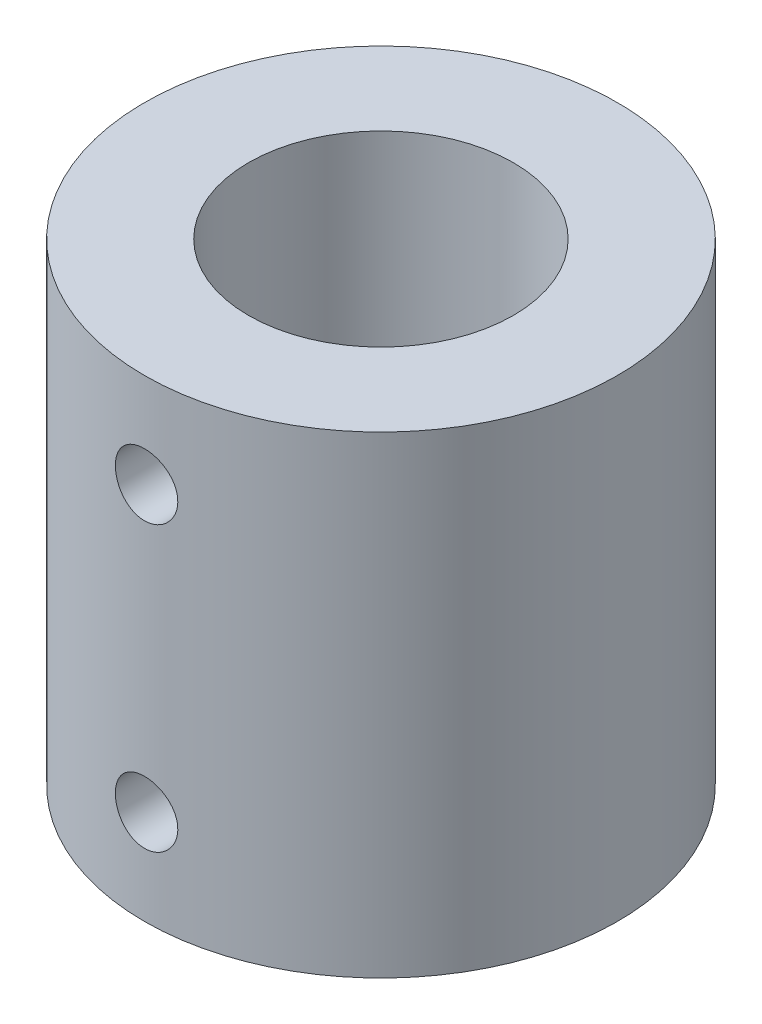
ISO-10303-21;
HEADER;
FILE_DESCRIPTION(('STEP AP214'),'2;1');
FILE_NAME('part.step','',(''),(''),'','','');
FILE_SCHEMA(('AUTOMOTIVE_DESIGN { 1 0 10303 214 1 1 1 1 }'));
ENDSEC;
DATA;
#1=APPLICATION_CONTEXT('core data for automotive mechanical design processes');
#2=APPLICATION_PROTOCOL_DEFINITION('international standard','automotive_design',2000,#1);
#3=PRODUCT_CONTEXT('',#1,'mechanical');
#4=PRODUCT('Part','Part','',(#3));
#5=PRODUCT_RELATED_PRODUCT_CATEGORY('part','',(#4));
#6=PRODUCT_DEFINITION_FORMATION('','',#4);
#7=PRODUCT_DEFINITION_CONTEXT('part definition',#1,'design');
#8=PRODUCT_DEFINITION('design','',#6,#7);
#9=PRODUCT_DEFINITION_SHAPE('','',#8);
#10=(LENGTH_UNIT() NAMED_UNIT(*) SI_UNIT(.MILLI.,.METRE.));
#11=(NAMED_UNIT(*) PLANE_ANGLE_UNIT() SI_UNIT($,.RADIAN.));
#12=(NAMED_UNIT(*) SI_UNIT($,.STERADIAN.) SOLID_ANGLE_UNIT());
#13=UNCERTAINTY_MEASURE_WITH_UNIT(LENGTH_MEASURE(1.E-05),#10,'distance_accuracy_value','');
#14=(GEOMETRIC_REPRESENTATION_CONTEXT(3) GLOBAL_UNCERTAINTY_ASSIGNED_CONTEXT((#13)) GLOBAL_UNIT_ASSIGNED_CONTEXT((#10,
#11,#12)) REPRESENTATION_CONTEXT('',''));
#15=CARTESIAN_POINT('',(0.,0.,0.));
#16=DIRECTION('',(0.,0.,1.));
#17=DIRECTION('',(1.,0.,0.));
#18=AXIS2_PLACEMENT_3D('',#15,#16,#17);
#19=CARTESIAN_POINT('',(0.,25.,0.));
#20=DIRECTION('',(0.,-1.,0.));
#21=DIRECTION('',(0.,0.,-1.));
#22=AXIS2_PLACEMENT_3D('',#19,#20,#21);
#23=CYLINDRICAL_SURFACE('',#22,3.);
#24=CARTESIAN_POINT('',(0.,12.5,0.));
#25=DIRECTION('',(0.,1.,0.));
#26=DIRECTION('',(0.,0.,1.));
#27=AXIS2_PLACEMENT_3D('',#24,#25,#26);
#28=CIRCLE('',#27,3.);
#29=CARTESIAN_POINT('',(0.,12.5,3.));
#30=VERTEX_POINT('',#29);
#31=EDGE_CURVE('E66',#30,#30,#28,.T.);
#32=ORIENTED_EDGE('',*,*,#31,.T.);
#33=EDGE_LOOP('',(#32));
#34=FACE_BOUND('',#33,.T.);
#35=CARTESIAN_POINT('',(0.,0.,0.));
#36=DIRECTION('',(0.,1.,0.));
#37=DIRECTION('',(0.,0.,1.));
#38=AXIS2_PLACEMENT_3D('',#35,#36,#37);
#39=CIRCLE('',#38,3.);
#40=CARTESIAN_POINT('',(0.,0.,3.));
#41=VERTEX_POINT('',#40);
#42=EDGE_CURVE('E61',#41,#41,#39,.T.);
#43=ORIENTED_EDGE('',*,*,#42,.F.);
#44=EDGE_LOOP('',(#43));
#45=FACE_BOUND('',#44,.T.);
#46=CARTESIAN_POINT('',(-1.65,5.,2.50549396327351));
#47=CARTESIAN_POINT('',(-1.64999358115515,4.91543775587579,2.50550290729145));
#48=CARTESIAN_POINT('',(-1.64345412095508,4.83080158035625,2.50984278304633));
#49=CARTESIAN_POINT('',(-1.61768357796128,4.6642419893439,2.52652305472094));
#50=CARTESIAN_POINT('',(-1.59843109830519,4.58232339226291,2.5388769381334));
#51=CARTESIAN_POINT('',(-1.54839133504121,4.42394184165835,2.56969514424061));
#52=CARTESIAN_POINT('',(-1.51767597794515,4.34744833636022,2.58812128253768));
#53=CARTESIAN_POINT('',(-1.44580368027316,4.20072925067674,2.62894573960704));
#54=CARTESIAN_POINT('',(-1.40464456372702,4.13050498062123,2.65134488586739));
#55=CARTESIAN_POINT('',(-1.30818987552103,3.99050697951391,2.70034227169485));
#56=CARTESIAN_POINT('',(-1.25188597568528,3.92149614307965,2.72713610292843));
#57=CARTESIAN_POINT('',(-1.12882249865068,3.79328457524384,2.78033402122329));
#58=CARTESIAN_POINT('',(-1.06205670422282,3.73408972055437,2.8067378662503));
#59=CARTESIAN_POINT('',(-0.912984038802342,3.62218721247504,2.85888255333956));
#60=CARTESIAN_POINT('',(-0.829835009326252,3.57047291087437,2.88437182872328));
#61=CARTESIAN_POINT('',(-0.654349556397893,3.48212209381967,2.92916377464779));
#62=CARTESIAN_POINT('',(-0.562020200659683,3.44547408910424,2.94847115688416));
#63=CARTESIAN_POINT('',(-0.37892285434317,3.39150601520037,2.97729382330391));
#64=CARTESIAN_POINT('',(-0.288663762188307,3.37283185672805,2.98749000620555));
#65=CARTESIAN_POINT('',(-0.105768848971923,3.35082522164806,2.99953120217528));
#66=CARTESIAN_POINT('',(-0.0131348834272864,3.34748111400143,3.00138254652496));
#67=CARTESIAN_POINT('',(0.161456942743379,3.3558401237369,2.99679126383707));
#68=CARTESIAN_POINT('',(0.243517036042417,3.36600430103803,2.99119680588262));
#69=CARTESIAN_POINT('',(0.40454893471368,3.39825613933327,2.97370139090637));
#70=CARTESIAN_POINT('',(0.483520502425808,3.42034471597395,2.96179994958743));
#71=CARTESIAN_POINT('',(0.637279429786408,3.47581759545011,2.93258792133284));
#72=CARTESIAN_POINT('',(0.712012587065493,3.50932095125488,2.91522047737549));
#73=CARTESIAN_POINT('',(0.854941741305339,3.58643144614225,2.87655421939416));
#74=CARTESIAN_POINT('',(0.923135637298121,3.63004181718505,2.85525414826244));
#75=CARTESIAN_POINT('',(1.05891717191853,3.73148475004153,2.80791814382438));
#76=CARTESIAN_POINT('',(1.12564617195586,3.7903439308726,2.78161920172535));
#77=CARTESIAN_POINT('',(1.24879377983835,3.91792420544975,2.72855637999779));
#78=CARTESIAN_POINT('',(1.3052016470546,3.98665544125848,2.70179204741386));
#79=CARTESIAN_POINT('',(1.41104757147093,4.13929795422943,2.64816260741378));
#80=CARTESIAN_POINT('',(1.45943898084593,4.22401217497651,2.62149493557528));
#81=CARTESIAN_POINT('',(1.54096072440202,4.4020876587557,2.57442669454811));
#82=CARTESIAN_POINT('',(1.57410870202277,4.49543877389511,2.55401888906632));
#83=CARTESIAN_POINT('',(1.621324807476,4.68038243391405,2.52428868885372));
#84=CARTESIAN_POINT('',(1.63671808149072,4.77150770718116,2.51420388175754));
#85=CARTESIAN_POINT('',(1.651976005483,4.95556143260455,2.50421132283931));
#86=CARTESIAN_POINT('',(1.65185841284551,5.0484877010052,2.50429193328554));
#87=CARTESIAN_POINT('',(1.63731066997579,5.21898069677553,2.51381291635781));
#88=CARTESIAN_POINT('',(1.6249632757909,5.29681676278818,2.52189118280772));
#89=CARTESIAN_POINT('',(1.58963092545288,5.4490948427084,2.54430898316227));
#90=CARTESIAN_POINT('',(1.56664130047229,5.52353535119722,2.55865126498177));
#91=CARTESIAN_POINT('',(1.50974087534156,5.67056841434069,2.59264701052962));
#92=CARTESIAN_POINT('',(1.47541058671725,5.74295082069504,2.61249886195853));
#93=CARTESIAN_POINT('',(1.39715088074391,5.88136153298298,2.6551752562818));
#94=CARTESIAN_POINT('',(1.35321671440464,5.94738667198259,2.67800126759515));
#95=CARTESIAN_POINT('',(1.24890384728535,6.08217598283305,2.72838745980259));
#96=CARTESIAN_POINT('',(1.18702256034847,6.14971665545365,2.75612471210542));
#97=CARTESIAN_POINT('',(1.05259034248068,6.27394463458245,2.81021466477288));
#98=CARTESIAN_POINT('',(0.980033198593376,6.33062557660595,2.83656654669951));
#99=CARTESIAN_POINT('',(0.821591432017623,6.43418356477834,2.88655886174343));
#100=CARTESIAN_POINT('',(0.735218364495388,6.48041980778174,2.90999476284885));
#101=CARTESIAN_POINT('',(0.554269536180266,6.55721430537587,2.94980224898628));
#102=CARTESIAN_POINT('',(0.459702424085395,6.58778886056153,2.96618117604292));
#103=CARTESIAN_POINT('',(0.275417797995458,6.62930611839183,2.98862325067975));
#104=CARTESIAN_POINT('',(0.186187129425339,6.64193096934435,2.99556705432428));
#105=CARTESIAN_POINT('',(0.00661676308886672,6.65243189343455,3.00133436858647));
#106=CARTESIAN_POINT('',(-0.0837223254250917,6.65031573581962,3.00016215675142));
#107=CARTESIAN_POINT('',(-0.25435836629703,6.63233007153813,2.99031042427524));
#108=CARTESIAN_POINT('',(-0.334831363047832,6.61770633320567,2.98231104671828));
#109=CARTESIAN_POINT('',(-0.491985833876877,6.57703517800952,2.96044701025379));
#110=CARTESIAN_POINT('',(-0.568666854326146,6.55098639804466,2.94658165149358));
#111=CARTESIAN_POINT('',(-0.719080279481092,6.48738736796038,2.91359875185443));
#112=CARTESIAN_POINT('',(-0.792622296205401,6.44947440595497,2.89431787940932));
#113=CARTESIAN_POINT('',(-0.932542405269453,6.36367449851233,2.85231650614788));
#114=CARTESIAN_POINT('',(-0.998917583844718,6.31578351940048,2.82959461529654));
#115=CARTESIAN_POINT('',(-1.13072210629174,6.20507399834962,2.77974517125015));
#116=CARTESIAN_POINT('',(-1.19516495605846,6.14117216627433,2.75241145940814));
#117=CARTESIAN_POINT('',(-1.31290440702821,6.00349286244808,2.69823878537055));
#118=CARTESIAN_POINT('',(-1.36618742691371,5.92970353472665,2.67140046184162));
#119=CARTESIAN_POINT('',(-1.46345962344263,5.76827599994856,2.61945108088931));
#120=CARTESIAN_POINT('',(-1.50659692748028,5.68004360140735,2.59457299089604));
#121=CARTESIAN_POINT('',(-1.57680093269354,5.49582119959132,2.55252885584285));
#122=CARTESIAN_POINT('',(-1.60391885150154,5.39985704717183,2.53533827536757));
#123=CARTESIAN_POINT('',(-1.6313948659609,5.25219121694154,2.5176692541321));
#124=CARTESIAN_POINT('',(-1.6383544404993,5.20212523584003,2.51313062613142));
#125=CARTESIAN_POINT('',(-1.64765888075615,5.10138168759252,2.50704033236465));
#126=CARTESIAN_POINT('',(-1.65000384878586,5.05070413403086,2.50548860037558));
#127=CARTESIAN_POINT('',(-1.65,5.,2.50549396327351));
#128=B_SPLINE_CURVE_WITH_KNOTS('',3,(#46,#47,#48,#49,#50,#51,#52,#53,#54,#55,#56,#57,#58,#59,
#60,#61,#62,#63,#64,#65,#66,#67,#68,#69,#70,#71,#72,#73,#74,#75,#76,#77,#78,#79,#80,#81,#82,#83,
#84,#85,#86,#87,#88,#89,#90,#91,#92,#93,#94,#95,#96,#97,#98,#99,#100,#101,#102,#103,#104,#105,
#106,#107,#108,#109,#110,#111,#112,#113,#114,#115,#116,#117,#118,#119,#120,#121,#122,#123,#124,
#125,#126,#127),.UNSPECIFIED.,.T.,.F.,(4,2,2,2,2,2,2,2,2,2,2,2,2,2,2,2,2,2,2,2,2,2,2,2,2,2,2,2,
2,2,2,2,2,2,2,2,2,2,2,2,4),(0.,0.253471464978916,0.507370630471963,0.759702723718415,
1.01208743389991,1.28998079678324,1.56803993512379,1.86997289364919,2.17167517502776,
2.44828286528195,2.72468065617498,2.9721366309398,3.21961160997027,3.46975098230538,
3.71997045333205,3.99717687977864,4.27467015892956,4.57652503396566,4.87802964361061,
5.15517475627462,5.43200258623579,5.66859462056208,5.905290548121,6.15196333618108,
6.39875837770523,6.68465599353131,6.97072065421035,7.27125286686233,7.57147164850534,
7.84111747203333,8.1106211895083,8.35604451303954,8.60149712555499,8.85533990697406,
9.10928550569675,9.39243346006448,9.67592402360688,9.97823556729934,10.2795752459721,
10.4315619419379,10.5835452681421),.UNSPECIFIED.);
#129=CARTESIAN_POINT('',(-1.65,5.,2.50549396327351));
#130=VERTEX_POINT('',#129);
#131=EDGE_CURVE('E98',#130,#130,#128,.T.);
#132=ORIENTED_EDGE('',*,*,#131,.T.);
#133=EDGE_LOOP('',(#132));
#134=FACE_BOUND('',#133,.T.);
#135=ADVANCED_FACE('F37',(#34,#45,#134),#23,.F.);
#136=CARTESIAN_POINT('',(0.,25.,0.));
#137=DIRECTION('',(0.,-1.,0.));
#138=DIRECTION('',(0.,0.,-1.));
#139=AXIS2_PLACEMENT_3D('',#136,#137,#138);
#140=CYLINDRICAL_SURFACE('',#139,12.5);
#141=CARTESIAN_POINT('',(0.,25.,0.));
#142=DIRECTION('',(0.,1.,0.));
#143=DIRECTION('',(0.,0.,1.));
#144=AXIS2_PLACEMENT_3D('',#141,#142,#143);
#145=CIRCLE('',#144,12.5);
#146=CARTESIAN_POINT('',(0.,25.,12.5));
#147=VERTEX_POINT('',#146);
#148=EDGE_CURVE('E50',#147,#147,#145,.T.);
#149=ORIENTED_EDGE('',*,*,#148,.F.);
#150=EDGE_LOOP('',(#149));
#151=FACE_BOUND('',#150,.T.);
#152=CARTESIAN_POINT('',(0.,0.,0.));
#153=DIRECTION('',(0.,1.,0.));
#154=DIRECTION('',(0.,0.,1.));
#155=AXIS2_PLACEMENT_3D('',#152,#153,#154);
#156=CIRCLE('',#155,12.5);
#157=CARTESIAN_POINT('',(0.,0.,12.5));
#158=VERTEX_POINT('',#157);
#159=EDGE_CURVE('E55',#158,#158,#156,.T.);
#160=ORIENTED_EDGE('',*,*,#159,.T.);
#161=EDGE_LOOP('',(#160));
#162=FACE_BOUND('',#161,.T.);
#163=CARTESIAN_POINT('',(0.,3.35,12.5));
#164=CARTESIAN_POINT('',(0.0922509659142324,3.35000389150703,12.4999986553884));
#165=CARTESIAN_POINT('',(0.184558502715377,3.35776267709436,12.498968007311));
#166=CARTESIAN_POINT('',(0.366601950920958,3.38858980345606,12.4949556982822));
#167=CARTESIAN_POINT('',(0.4563351259759,3.41167384749907,12.4919720361882));
#168=CARTESIAN_POINT('',(0.630568283941343,3.47245693419571,12.4843896079466));
#169=CARTESIAN_POINT('',(0.71507185631948,3.51014582048222,12.4797919643879));
#170=CARTESIAN_POINT('',(0.876539590939074,3.59904581496624,12.4694920533569));
#171=CARTESIAN_POINT('',(0.953504978702877,3.65025472012364,12.4637899658902));
#172=CARTESIAN_POINT('',(1.09819718658205,3.7650753837501,12.4518781663594));
#173=CARTESIAN_POINT('',(1.1658712816474,3.82875332108865,12.4456658531834));
#174=CARTESIAN_POINT('',(1.28960557413889,3.96656225461109,12.4334545778039));
#175=CARTESIAN_POINT('',(1.34566516063208,4.04069380031909,12.4274556268374));
#176=CARTESIAN_POINT('',(1.44477796066646,4.19765149365061,12.4163248280925));
#177=CARTESIAN_POINT('',(1.48778133107337,4.28050937377425,12.4111963353939));
#178=CARTESIAN_POINT('',(1.55924262980494,4.45235015180618,12.4024218004722));
#179=CARTESIAN_POINT('',(1.58770117215908,4.54133279096953,12.3987756956693));
#180=CARTESIAN_POINT('',(1.62910377910463,4.72234784890981,12.3934038347284));
#181=CARTESIAN_POINT('',(1.64213723047393,4.81435948871567,12.3916670186782));
#182=CARTESIAN_POINT('',(1.65259636155461,4.99927914827236,12.3902766213381));
#183=CARTESIAN_POINT('',(1.65002273886784,5.09218712777345,12.3906229469364));
#184=CARTESIAN_POINT('',(1.6294140660036,5.27563699086018,12.3933495814873));
#185=CARTESIAN_POINT('',(1.61147776254765,5.36619018822612,12.395716899785));
#186=CARTESIAN_POINT('',(1.56080707632498,5.54299015751685,12.4021985149079));
#187=CARTESIAN_POINT('',(1.52807236230629,5.6292368329952,12.4063128508388));
#188=CARTESIAN_POINT('',(1.44862884068035,5.79528063970321,12.4158395520745));
#189=CARTESIAN_POINT('',(1.40187740731702,5.87505714083283,12.4212558666767));
#190=CARTESIAN_POINT('',(1.29575800474393,6.02566987367712,12.4327732471151));
#191=CARTESIAN_POINT('',(1.23638939245274,6.09650564940105,12.4388743478466));
#192=CARTESIAN_POINT('',(1.10617499798151,6.22779910123927,12.4511315214541));
#193=CARTESIAN_POINT('',(1.03524415653745,6.288172443475,12.4572876551223));
#194=CARTESIAN_POINT('',(0.884210857811215,6.3961696449878,12.4689172796715));
#195=CARTESIAN_POINT('',(0.804108375018421,6.44379346880128,12.4743907686536));
#196=CARTESIAN_POINT('',(0.636938460986387,6.5249409446003,12.484042355461));
#197=CARTESIAN_POINT('',(0.549868279152678,6.55845899513269,12.4882199385046));
#198=CARTESIAN_POINT('',(0.371267976474141,6.61037485956513,12.4948044580827));
#199=CARTESIAN_POINT('',(0.279738088894885,6.6287734633927,12.4972114871206));
#200=CARTESIAN_POINT('',(0.0955454110605704,6.64981811969115,12.4999716099048));
#201=CARTESIAN_POINT('',(0.00289610511857599,6.65258028450897,12.5003398427993));
#202=CARTESIAN_POINT('',(-0.181544148381849,6.64258054262136,12.4990218465851));
#203=CARTESIAN_POINT('',(-0.273335116324649,6.62981900553124,12.4973356663916));
#204=CARTESIAN_POINT('',(-0.453108088985702,6.5892306026245,12.4921077115532));
#205=CARTESIAN_POINT('',(-0.541102881534317,6.56145941737239,12.4885727966281));
#206=CARTESIAN_POINT('',(-0.711186579168432,6.49169814598314,12.4800429260914));
#207=CARTESIAN_POINT('',(-0.793275262802479,6.44970752702029,12.4750479157687));
#208=CARTESIAN_POINT('',(-0.949733027407935,6.35242066007777,12.4641165128389));
#209=CARTESIAN_POINT('',(-1.02405527014396,6.29704968324978,12.4581748993319));
#210=CARTESIAN_POINT('',(-1.16239311646148,6.17467915559439,12.4460304374708));
#211=CARTESIAN_POINT('',(-1.22640826160187,6.10767908780128,12.4398275775125));
#212=CARTESIAN_POINT('',(-1.34272949930146,5.96343933060332,12.427812668937));
#213=CARTESIAN_POINT('',(-1.39495839046206,5.88613712057612,12.422003362126));
#214=CARTESIAN_POINT('',(-1.48569034045958,5.72378924080387,12.4114793355964));
#215=CARTESIAN_POINT('',(-1.52419370073337,5.63874374116664,12.40676459184));
#216=CARTESIAN_POINT('',(-1.5862580202103,5.4635675424022,12.3989825257156));
#217=CARTESIAN_POINT('',(-1.60986174308102,5.37345221257723,12.395910492496));
#218=CARTESIAN_POINT('',(-1.64159408961648,5.19049367855157,12.3917484325846));
#219=CARTESIAN_POINT('',(-1.64972352322195,5.09765061738152,12.390658302158));
#220=CARTESIAN_POINT('',(-1.65026050729394,4.91264048140782,12.3905867313463));
#221=CARTESIAN_POINT('',(-1.64278936343219,4.82047374161902,12.3915890208826));
#222=CARTESIAN_POINT('',(-1.61259495475241,4.63871858376872,12.3955542787341));
#223=CARTESIAN_POINT('',(-1.58987169439037,4.54913016495395,12.3985172464765));
#224=CARTESIAN_POINT('',(-1.52985734760343,4.37509536720208,12.4060648042427));
#225=CARTESIAN_POINT('',(-1.49257280459361,4.2906466982857,12.4106486657967));
#226=CARTESIAN_POINT('',(-1.40450618423476,4.12918453461484,12.4209226365687));
#227=CARTESIAN_POINT('',(-1.35372386121888,4.05217117522176,12.4266127659209));
#228=CARTESIAN_POINT('',(-1.23965546715595,3.90714655415515,12.4385110765891));
#229=CARTESIAN_POINT('',(-1.17627910409951,3.8392065959392,12.4447228000133));
#230=CARTESIAN_POINT('',(-1.03901112502639,3.71488064994685,12.4569335544568));
#231=CARTESIAN_POINT('',(-0.96511704377438,3.6584973785098,12.4629325351987));
#232=CARTESIAN_POINT('',(-0.808549280168613,3.55867888501618,12.4740702486112));
#233=CARTESIAN_POINT('',(-0.725839748433106,3.51529949779812,12.4792052313115));
#234=CARTESIAN_POINT('',(-0.55428610212764,3.44310916931126,12.4879988146703));
#235=CARTESIAN_POINT('',(-0.465448689177244,3.41428259103999,12.4916589991428));
#236=CARTESIAN_POINT('',(-0.313472456145788,3.37882265613532,12.4962204250721));
#237=CARTESIAN_POINT('',(-0.251287086879961,3.36802994756124,12.4976307637456));
#238=CARTESIAN_POINT('',(-0.126076615825898,3.3536173203671,12.4995210067266));
#239=CARTESIAN_POINT('',(-0.0630515212430905,3.3499973402399,12.5000009190127));
#240=CARTESIAN_POINT('',(0.,3.35,12.5));
#241=B_SPLINE_CURVE_WITH_KNOTS('',3,(#163,#164,#165,#166,#167,#168,#169,#170,#171,#172,#173,
#174,#175,#176,#177,#178,#179,#180,#181,#182,#183,#184,#185,#186,#187,#188,#189,#190,#191,#192,
#193,#194,#195,#196,#197,#198,#199,#200,#201,#202,#203,#204,#205,#206,#207,#208,#209,#210,#211,
#212,#213,#214,#215,#216,#217,#218,#219,#220,#221,#222,#223,#224,#225,#226,#227,#228,#229,#230,
#231,#232,#233,#234,#235,#236,#237,#238,#239,#240),.UNSPECIFIED.,.T.,.F.,(4,2,2,2,2,2,2,2,2,2,2,
2,2,2,2,2,2,2,2,2,2,2,2,2,2,2,2,2,2,2,2,2,2,2,2,2,2,2,4),(0.,0.276522567593411,
0.553328916636196,0.829943115961213,1.106512269752,1.38459116209452,1.66268467791007,
1.94182686179847,2.22095726035026,2.49846208170458,2.77595449929574,3.05167655007196,
3.32740477299745,3.60398015842833,3.88056964393413,4.159294237539,4.43801960642627,
4.71685555395558,4.99567693255305,5.27242510869489,5.5491666956633,5.82488864439133,
6.10062092602062,6.37793027840446,6.65525196160273,6.93434056471003,7.21342303816142,
7.49170082672567,7.76996404953484,8.04607163604137,8.32217914188149,8.59816271557356,
8.874151312659,9.15219502941572,9.43030402415317,9.70959057439001,9.98857638890452,
10.1775751477029,10.3665722858035),.UNSPECIFIED.);
#242=CARTESIAN_POINT('',(0.,3.35,12.5));
#243=VERTEX_POINT('',#242);
#244=EDGE_CURVE('E10',#243,#243,#241,.T.);
#245=ORIENTED_EDGE('',*,*,#244,.F.);
#246=EDGE_LOOP('',(#245));
#247=FACE_BOUND('',#246,.T.);
#248=CARTESIAN_POINT('',(0.,18.35,12.5));
#249=CARTESIAN_POINT('',(0.0922509659142325,18.350003891507,12.4999986553884));
#250=CARTESIAN_POINT('',(0.184558502715377,18.3577626770944,12.498968007311));
#251=CARTESIAN_POINT('',(0.366601950920958,18.3885898034561,12.4949556982822));
#252=CARTESIAN_POINT('',(0.456335125975901,18.4116738474991,12.4919720361882));
#253=CARTESIAN_POINT('',(0.630568283941344,18.4724569341957,12.4843896079466));
#254=CARTESIAN_POINT('',(0.715071856319482,18.5101458204822,12.4797919643879));
#255=CARTESIAN_POINT('',(0.876539590939075,18.5990458149662,12.4694920533569));
#256=CARTESIAN_POINT('',(0.953504978702877,18.6502547201236,12.4637899658902));
#257=CARTESIAN_POINT('',(1.09819718658206,18.7650753837501,12.4518781663594));
#258=CARTESIAN_POINT('',(1.1658712816474,18.8287533210886,12.4456658531834));
#259=CARTESIAN_POINT('',(1.28960557413889,18.9665622546111,12.4334545778039));
#260=CARTESIAN_POINT('',(1.34566516063208,19.0406938003191,12.4274556268374));
#261=CARTESIAN_POINT('',(1.44477796066646,19.1976514936506,12.4163248280925));
#262=CARTESIAN_POINT('',(1.48778133107337,19.2805093737743,12.4111963353939));
#263=CARTESIAN_POINT('',(1.55924262980494,19.4523501518062,12.4024218004722));
#264=CARTESIAN_POINT('',(1.58770117215908,19.5413327909695,12.3987756956693));
#265=CARTESIAN_POINT('',(1.62910377910463,19.7223478489098,12.3934038347284));
#266=CARTESIAN_POINT('',(1.64213723047393,19.8143594887157,12.3916670186782));
#267=CARTESIAN_POINT('',(1.65259636155461,19.9992791482724,12.3902766213381));
#268=CARTESIAN_POINT('',(1.65002273886784,20.0921871277734,12.3906229469364));
#269=CARTESIAN_POINT('',(1.6294140660036,20.2756369908602,12.3933495814873));
#270=CARTESIAN_POINT('',(1.61147776254765,20.3661901882261,12.395716899785));
#271=CARTESIAN_POINT('',(1.56080707632498,20.5429901575168,12.4021985149079));
#272=CARTESIAN_POINT('',(1.52807236230629,20.6292368329952,12.4063128508388));
#273=CARTESIAN_POINT('',(1.44862884068035,20.7952806397032,12.4158395520745));
#274=CARTESIAN_POINT('',(1.40187740731702,20.8750571408328,12.4212558666767));
#275=CARTESIAN_POINT('',(1.29575800474393,21.0256698736771,12.4327732471151));
#276=CARTESIAN_POINT('',(1.23638939245274,21.0965056494011,12.4388743478466));
#277=CARTESIAN_POINT('',(1.10617499798151,21.2277991012393,12.4511315214541));
#278=CARTESIAN_POINT('',(1.03524415653745,21.288172443475,12.4572876551223));
#279=CARTESIAN_POINT('',(0.884210857811216,21.3961696449878,12.4689172796715));
#280=CARTESIAN_POINT('',(0.804108375018422,21.4437934688013,12.4743907686536));
#281=CARTESIAN_POINT('',(0.636938460986388,21.5249409446003,12.484042355461));
#282=CARTESIAN_POINT('',(0.549868279152678,21.5584589951327,12.4882199385046));
#283=CARTESIAN_POINT('',(0.371267976474141,21.6103748595651,12.4948044580827));
#284=CARTESIAN_POINT('',(0.279738088894884,21.6287734633927,12.4972114871206));
#285=CARTESIAN_POINT('',(0.0955454110605699,21.6498181196911,12.4999716099048));
#286=CARTESIAN_POINT('',(0.00289610511857554,21.652580284509,12.5003398427993));
#287=CARTESIAN_POINT('',(-0.181544148381849,21.6425805426214,12.4990218465851));
#288=CARTESIAN_POINT('',(-0.27333511632465,21.6298190055312,12.4973356663916));
#289=CARTESIAN_POINT('',(-0.453108088985702,21.5892306026245,12.4921077115532));
#290=CARTESIAN_POINT('',(-0.541102881534316,21.5614594173724,12.4885727966281));
#291=CARTESIAN_POINT('',(-0.711186579168432,21.4916981459831,12.4800429260914));
#292=CARTESIAN_POINT('',(-0.793275262802479,21.4497075270203,12.4750479157687));
#293=CARTESIAN_POINT('',(-0.949733027407937,21.3524206600778,12.4641165128389));
#294=CARTESIAN_POINT('',(-1.02405527014396,21.2970496832498,12.4581748993319));
#295=CARTESIAN_POINT('',(-1.16239311646148,21.1746791555944,12.4460304374708));
#296=CARTESIAN_POINT('',(-1.22640826160187,21.1076790878013,12.4398275775125));
#297=CARTESIAN_POINT('',(-1.34272949930146,20.9634393306033,12.427812668937));
#298=CARTESIAN_POINT('',(-1.39495839046206,20.8861371205761,12.422003362126));
#299=CARTESIAN_POINT('',(-1.48569034045958,20.7237892408039,12.4114793355964));
#300=CARTESIAN_POINT('',(-1.52419370073336,20.6387437411666,12.40676459184));
#301=CARTESIAN_POINT('',(-1.5862580202103,20.4635675424022,12.3989825257156));
#302=CARTESIAN_POINT('',(-1.60986174308102,20.3734522125772,12.395910492496));
#303=CARTESIAN_POINT('',(-1.64159408961648,20.1904936785516,12.3917484325846));
#304=CARTESIAN_POINT('',(-1.64972352322195,20.0976506173815,12.390658302158));
#305=CARTESIAN_POINT('',(-1.65026050729394,19.9126404814078,12.3905867313463));
#306=CARTESIAN_POINT('',(-1.64278936343219,19.820473741619,12.3915890208826));
#307=CARTESIAN_POINT('',(-1.61259495475241,19.6387185837687,12.3955542787341));
#308=CARTESIAN_POINT('',(-1.58987169439037,19.5491301649539,12.3985172464765));
#309=CARTESIAN_POINT('',(-1.52985734760343,19.3750953672021,12.4060648042427));
#310=CARTESIAN_POINT('',(-1.49257280459361,19.2906466982857,12.4106486657967));
#311=CARTESIAN_POINT('',(-1.40450618423476,19.1291845346148,12.4209226365687));
#312=CARTESIAN_POINT('',(-1.35372386121888,19.0521711752218,12.4266127659209));
#313=CARTESIAN_POINT('',(-1.23965546715595,18.9071465541551,12.4385110765891));
#314=CARTESIAN_POINT('',(-1.17627910409951,18.8392065959392,12.4447228000133));
#315=CARTESIAN_POINT('',(-1.03901112502639,18.7148806499469,12.4569335544568));
#316=CARTESIAN_POINT('',(-0.965117043774378,18.6584973785098,12.4629325351987));
#317=CARTESIAN_POINT('',(-0.808549280168611,18.5586788850162,12.4740702486112));
#318=CARTESIAN_POINT('',(-0.725839748433105,18.5152994977981,12.4792052313115));
#319=CARTESIAN_POINT('',(-0.55428610212764,18.4431091693113,12.4879988146703));
#320=CARTESIAN_POINT('',(-0.465448689177244,18.41428259104,12.4916589991428));
#321=CARTESIAN_POINT('',(-0.313472456145789,18.3788226561353,12.4962204250721));
#322=CARTESIAN_POINT('',(-0.251287086879962,18.3680299475612,12.4976307637456));
#323=CARTESIAN_POINT('',(-0.126076615825899,18.3536173203671,12.4995210067266));
#324=CARTESIAN_POINT('',(-0.0630515212430909,18.3499973402399,12.5000009190127));
#325=CARTESIAN_POINT('',(0.,18.35,12.5));
#326=B_SPLINE_CURVE_WITH_KNOTS('',3,(#248,#249,#250,#251,#252,#253,#254,#255,#256,#257,#258,
#259,#260,#261,#262,#263,#264,#265,#266,#267,#268,#269,#270,#271,#272,#273,#274,#275,#276,#277,
#278,#279,#280,#281,#282,#283,#284,#285,#286,#287,#288,#289,#290,#291,#292,#293,#294,#295,#296,
#297,#298,#299,#300,#301,#302,#303,#304,#305,#306,#307,#308,#309,#310,#311,#312,#313,#314,#315,
#316,#317,#318,#319,#320,#321,#322,#323,#324,#325),.UNSPECIFIED.,.T.,.F.,(4,2,2,2,2,2,2,2,2,2,2,
2,2,2,2,2,2,2,2,2,2,2,2,2,2,2,2,2,2,2,2,2,2,2,2,2,2,2,4),(0.,0.276522567593411,
0.553328916636197,0.829943115961215,1.106512269752,1.38459116209452,1.66268467791008,
1.94182686179848,2.22095726035026,2.49846208170459,2.77595449929574,3.05167655007195,
3.32740477299744,3.60398015842833,3.88056964393413,4.15929423753899,4.43801960642627,
4.71685555395558,4.99567693255305,5.27242510869489,5.5491666956633,5.82488864439132,
6.10062092602062,6.37793027840446,6.65525196160272,6.93434056471003,7.21342303816142,
7.49170082672567,7.76996404953483,8.04607163604137,8.3221791418815,8.59816271557356,
8.874151312659,9.15219502941572,9.43030402415317,9.70959057439001,9.98857638890452,
10.1775751477029,10.3665722858035),.UNSPECIFIED.);
#327=CARTESIAN_POINT('',(0.,18.35,12.5));
#328=VERTEX_POINT('',#327);
#329=EDGE_CURVE('E78',#328,#328,#326,.T.);
#330=ORIENTED_EDGE('',*,*,#329,.F.);
#331=EDGE_LOOP('',(#330));
#332=FACE_BOUND('',#331,.T.);
#333=ADVANCED_FACE('F39',(#151,#162,#247,#332),#140,.T.);
#334=CARTESIAN_POINT('',(0.,12.5,0.));
#335=DIRECTION('',(0.,1.,0.));
#336=DIRECTION('',(0.,0.,1.));
#337=AXIS2_PLACEMENT_3D('',#334,#335,#336);
#338=CYLINDRICAL_SURFACE('',#337,7.);
#339=CARTESIAN_POINT('',(0.,12.5,0.));
#340=DIRECTION('',(0.,1.,0.));
#341=DIRECTION('',(0.,0.,1.));
#342=AXIS2_PLACEMENT_3D('',#339,#340,#341);
#343=CIRCLE('',#342,7.);
#344=CARTESIAN_POINT('',(0.,12.5,7.));
#345=VERTEX_POINT('',#344);
#346=EDGE_CURVE('E69',#345,#345,#343,.T.);
#347=ORIENTED_EDGE('',*,*,#346,.F.);
#348=EDGE_LOOP('',(#347));
#349=FACE_BOUND('',#348,.T.);
#350=CARTESIAN_POINT('',(0.,25.,0.));
#351=DIRECTION('',(0.,1.,0.));
#352=DIRECTION('',(0.,0.,1.));
#353=AXIS2_PLACEMENT_3D('',#350,#351,#352);
#354=CIRCLE('',#353,7.);
#355=CARTESIAN_POINT('',(0.,25.,7.));
#356=VERTEX_POINT('',#355);
#357=EDGE_CURVE('E105',#356,#356,#354,.T.);
#358=ORIENTED_EDGE('',*,*,#357,.T.);
#359=EDGE_LOOP('',(#358));
#360=FACE_BOUND('',#359,.T.);
#361=CARTESIAN_POINT('',(0.,18.35,7.));
#362=CARTESIAN_POINT('',(-0.0913287393176136,18.3500028438791,6.99999836647252));
#363=CARTESIAN_POINT('',(-0.182690417283304,18.3576082308494,6.99819467849873));
#364=CARTESIAN_POINT('',(-0.362806323664361,18.3877899014695,6.9911739036526));
#365=CARTESIAN_POINT('',(-0.451558855012934,18.4103757132748,6.98595464436713));
#366=CARTESIAN_POINT('',(-0.623828476855957,18.4697617740175,6.97268218331077));
#367=CARTESIAN_POINT('',(-0.707351348819676,18.506545992007,6.96463217854926));
#368=CARTESIAN_POINT('',(-0.867039208328408,18.5932308487153,6.9465609541058));
#369=CARTESIAN_POINT('',(-0.943204151262113,18.6431315669529,6.93653972247338));
#370=CARTESIAN_POINT('',(-1.0874214344422,18.7556068216523,6.91541181493805));
#371=CARTESIAN_POINT('',(-1.15531854158778,18.8183775535553,6.90428991213628));
#372=CARTESIAN_POINT('',(-1.27972508274131,18.9543904091733,6.88231817514457));
#373=CARTESIAN_POINT('',(-1.33623336463363,19.0276335910217,6.87146836857753));
#374=CARTESIAN_POINT('',(-1.43696684618771,19.183690367456,6.85111743990827));
#375=CARTESIAN_POINT('',(-1.48102236520305,19.2666162504234,6.84163573776828));
#376=CARTESIAN_POINT('',(-1.5545098915109,19.4389557217021,6.8253150534534));
#377=CARTESIAN_POINT('',(-1.58394395433771,19.5283683960515,6.81847569983819));
#378=CARTESIAN_POINT('',(-1.62683125284546,19.709446972031,6.80836995693017));
#379=CARTESIAN_POINT('',(-1.64056162843084,19.8010437042244,6.80504168835829));
#380=CARTESIAN_POINT('',(-1.65251435457551,19.9852963536641,6.80214944752779));
#381=CARTESIAN_POINT('',(-1.65073893306961,20.077952116834,6.80258493447765));
#382=CARTESIAN_POINT('',(-1.63195247769315,20.2595991807959,6.80711518628286));
#383=CARTESIAN_POINT('',(-1.61526770664355,20.3486264799633,6.81113158544196));
#384=CARTESIAN_POINT('',(-1.56765494743684,20.5225815195126,6.82224669705885));
#385=CARTESIAN_POINT('',(-1.53672604569693,20.607508996556,6.82934560721949));
#386=CARTESIAN_POINT('',(-1.46121486998613,20.7717483970526,6.84590028619908));
#387=CARTESIAN_POINT('',(-1.41651088097455,20.8510021693965,6.85537691977426));
#388=CARTESIAN_POINT('',(-1.31480384080152,21.0010021209479,6.87560701771075));
#389=CARTESIAN_POINT('',(-1.25779885989578,21.0717469625837,6.88636068228985));
#390=CARTESIAN_POINT('',(-1.13140044923305,21.2045947976965,6.90826612497409));
#391=CARTESIAN_POINT('',(-1.06173067039407,21.266434627954,6.91942110106382));
#392=CARTESIAN_POINT('',(-0.912878848692457,21.3775996470009,6.940626418642));
#393=CARTESIAN_POINT('',(-0.833696575268987,21.4269245323669,6.95067673334471));
#394=CARTESIAN_POINT('',(-0.667717693598598,21.5117410234795,6.9685816950737));
#395=CARTESIAN_POINT('',(-0.580900533100759,21.5471937986791,6.97643016161576));
#396=CARTESIAN_POINT('',(-0.402313719817364,21.6029315534366,6.98900179511064));
#397=CARTESIAN_POINT('',(-0.310544909289164,21.6232191038775,6.99372549177409));
#398=CARTESIAN_POINT('',(-0.126913198899205,21.6476576843328,6.9994383716222));
#399=CARTESIAN_POINT('',(-0.0351005767602178,21.6521675966987,7.00051059686152));
#400=CARTESIAN_POINT('',(0.14796668550166,21.6459017236309,6.99903444009398));
#401=CARTESIAN_POINT('',(0.239221369368368,21.6351271523838,6.99648634568227));
#402=CARTESIAN_POINT('',(0.417362653019775,21.5988949207626,6.98810869992012));
#403=CARTESIAN_POINT('',(0.504290552421108,21.5736294864757,6.98232213187254));
#404=CARTESIAN_POINT('',(0.672672276070124,21.5093493491236,6.96811723407212));
#405=CARTESIAN_POINT('',(0.754125584648716,21.4703333530044,6.9596986568229));
#406=CARTESIAN_POINT('',(0.910700498955401,21.3789395779136,6.94096161251794));
#407=CARTESIAN_POINT('',(0.985698570997656,21.326356139424,6.93061465221504));
#408=CARTESIAN_POINT('',(1.1259344495591,21.2095866807575,6.90921937825115));
#409=CARTESIAN_POINT('',(1.19117076625592,21.1453988928389,6.89817095790026));
#410=CARTESIAN_POINT('',(1.31148229591092,21.005584944694,6.87632466673189));
#411=CARTESIAN_POINT('',(1.36630717929423,20.9297413874034,6.865537385707));
#412=CARTESIAN_POINT('',(1.46244648293613,20.7697152076755,6.84570445168463));
#413=CARTESIAN_POINT('',(1.50376150719305,20.6855329582636,6.83665872083343));
#414=CARTESIAN_POINT('',(1.57141076668764,20.5116787255392,6.82142736146698));
#415=CARTESIAN_POINT('',(1.59783286852027,20.4220424731416,6.81522499881539));
#416=CARTESIAN_POINT('',(1.63519178674544,20.2394343441632,6.80635903572141));
#417=CARTESIAN_POINT('',(1.64613154940225,20.1464631056788,6.80369476199233));
#418=CARTESIAN_POINT('',(1.65207449167987,19.9623599241637,6.80225382726605));
#419=CARTESIAN_POINT('',(1.6474761616919,19.8712413868986,6.8033799546054));
#420=CARTESIAN_POINT('',(1.62337546677894,19.6911176363332,6.80917049161347));
#421=CARTESIAN_POINT('',(1.60387333967241,19.6021123893346,6.81383484482306));
#422=CARTESIAN_POINT('',(1.55072477614989,19.4291198939373,6.82612522897376));
#423=CARTESIAN_POINT('',(1.51714519678738,19.3451110422485,6.83373724790254));
#424=CARTESIAN_POINT('',(1.43684939858625,19.1838634885203,6.85106877692285));
#425=CARTESIAN_POINT('',(1.39013156490448,19.1066256202448,6.86078854604759));
#426=CARTESIAN_POINT('',(1.28360204537891,18.9591683482974,6.88152384189012));
#427=CARTESIAN_POINT('',(1.22351026298738,18.8891547688947,6.89256431174075));
#428=CARTESIAN_POINT('',(1.09249493531384,18.7600751611101,6.91453965388042));
#429=CARTESIAN_POINT('',(1.02156885982585,18.7010116971341,6.92547450086677));
#430=CARTESIAN_POINT('',(0.86956273422003,18.59461714467,6.9462096972569));
#431=CARTESIAN_POINT('',(0.788341489140677,18.5474835464359,6.95598967744618));
#432=CARTESIAN_POINT('',(0.618909771082386,18.467613790428,6.97310375804727));
#433=CARTESIAN_POINT('',(0.53070477860151,18.4348664726232,6.98043975328753));
#434=CARTESIAN_POINT('',(0.368778884805454,18.3900257794995,6.99064750922865));
#435=CARTESIAN_POINT('',(0.29588194683886,18.3750467087844,6.99413174237217));
#436=CARTESIAN_POINT('',(0.148663891408629,18.3550329561335,6.99880858473134));
#437=CARTESIAN_POINT('',(0.0743428585838587,18.349997685043,7.00000132971399));
#438=CARTESIAN_POINT('',(0.,18.35,7.));
#439=B_SPLINE_CURVE_WITH_KNOTS('',3,(#361,#362,#363,#364,#365,#366,#367,#368,#369,#370,#371,
#372,#373,#374,#375,#376,#377,#378,#379,#380,#381,#382,#383,#384,#385,#386,#387,#388,#389,#390,
#391,#392,#393,#394,#395,#396,#397,#398,#399,#400,#401,#402,#403,#404,#405,#406,#407,#408,#409,
#410,#411,#412,#413,#414,#415,#416,#417,#418,#419,#420,#421,#422,#423,#424,#425,#426,#427,#428,
#429,#430,#431,#432,#433,#434,#435,#436,#437,#438),.UNSPECIFIED.,.T.,.F.,(4,2,2,2,2,2,2,2,2,2,2,
2,2,2,2,2,2,2,2,2,2,2,2,2,2,2,2,2,2,2,2,2,2,2,2,2,2,2,4),(0.,0.273713930465045,
0.547602121208315,0.821181974218381,1.09476348584582,1.37287554367486,1.65101572175226,
1.93278083587447,2.21450632727553,2.49117922951627,2.76781237894396,3.0385362810522,
3.30927754913057,3.5824831951294,3.85573173204488,4.13587649000043,4.41602803938654,
4.69695826763982,4.97784086042084,5.25229133365971,5.52672000600246,5.79758981692428,
6.06848510628022,6.34375631656429,6.61906949551376,6.90033819981441,7.18159432744314,
7.46117322376554,7.74069890951611,8.01311084713954,8.28551843800228,8.55664670189891,
8.82780830516573,9.10529722607675,9.38285105021363,9.66473658497752,9.94640306170604,
10.1692231938147,10.3920301237804),.UNSPECIFIED.);
#440=CARTESIAN_POINT('',(0.,18.35,7.));
#441=VERTEX_POINT('',#440);
#442=EDGE_CURVE('E70',#441,#441,#439,.T.);
#443=ORIENTED_EDGE('',*,*,#442,.F.);
#444=EDGE_LOOP('',(#443));
#445=FACE_BOUND('',#444,.T.);
#446=ADVANCED_FACE('F79',(#349,#360,#445),#338,.F.);
#447=CARTESIAN_POINT('',(0.,25.,0.));
#448=DIRECTION('',(0.,1.,0.));
#449=DIRECTION('',(0.,0.,1.));
#450=AXIS2_PLACEMENT_3D('',#447,#448,#449);
#451=PLANE('',#450);
#452=ORIENTED_EDGE('',*,*,#357,.F.);
#453=EDGE_LOOP('',(#452));
#454=FACE_BOUND('',#453,.T.);
#455=ORIENTED_EDGE('',*,*,#148,.T.);
#456=EDGE_LOOP('',(#455));
#457=FACE_BOUND('',#456,.T.);
#458=ADVANCED_FACE('F110',(#454,#457),#451,.T.);
#459=CARTESIAN_POINT('',(0.,0.,0.));
#460=DIRECTION('',(0.,1.,0.));
#461=DIRECTION('',(0.,0.,1.));
#462=AXIS2_PLACEMENT_3D('',#459,#460,#461);
#463=PLANE('',#462);
#464=ORIENTED_EDGE('',*,*,#159,.F.);
#465=EDGE_LOOP('',(#464));
#466=FACE_BOUND('',#465,.T.);
#467=ORIENTED_EDGE('',*,*,#42,.T.);
#468=EDGE_LOOP('',(#467));
#469=FACE_BOUND('',#468,.T.);
#470=ADVANCED_FACE('F112',(#466,#469),#463,.F.);
#471=CARTESIAN_POINT('',(0.,12.5,0.));
#472=DIRECTION('',(0.,1.,0.));
#473=DIRECTION('',(0.,0.,1.));
#474=AXIS2_PLACEMENT_3D('',#471,#472,#473);
#475=PLANE('',#474);
#476=ORIENTED_EDGE('',*,*,#31,.F.);
#477=EDGE_LOOP('',(#476));
#478=FACE_BOUND('',#477,.T.);
#479=ORIENTED_EDGE('',*,*,#346,.T.);
#480=EDGE_LOOP('',(#479));
#481=FACE_BOUND('',#480,.T.);
#482=ADVANCED_FACE('F87',(#478,#481),#475,.T.);
#483=CARTESIAN_POINT('',(0.,20.,12.5));
#484=DIRECTION('',(0.,0.,-1.));
#485=DIRECTION('',(-1.,0.,0.));
#486=AXIS2_PLACEMENT_3D('',#483,#484,#485);
#487=CYLINDRICAL_SURFACE('',#486,1.65);
#488=ORIENTED_EDGE('',*,*,#442,.T.);
#489=EDGE_LOOP('',(#488));
#490=FACE_BOUND('',#489,.T.);
#491=ORIENTED_EDGE('',*,*,#329,.T.);
#492=EDGE_LOOP('',(#491));
#493=FACE_BOUND('',#492,.T.);
#494=ADVANCED_FACE('F83',(#490,#493),#487,.F.);
#495=CARTESIAN_POINT('',(0.,5.,12.5));
#496=DIRECTION('',(0.,0.,-1.));
#497=DIRECTION('',(-1.,0.,0.));
#498=AXIS2_PLACEMENT_3D('',#495,#496,#497);
#499=CYLINDRICAL_SURFACE('',#498,1.65);
#500=ORIENTED_EDGE('',*,*,#131,.F.);
#501=EDGE_LOOP('',(#500));
#502=FACE_BOUND('',#501,.T.);
#503=ORIENTED_EDGE('',*,*,#244,.T.);
#504=EDGE_LOOP('',(#503));
#505=FACE_BOUND('',#504,.T.);
#506=ADVANCED_FACE('F86',(#502,#505),#499,.F.);
#507=CLOSED_SHELL('',(#135,#333,#446,#458,#470,#482,#494,#506));
#508=MANIFOLD_SOLID_BREP('B2',#507);
#509=ADVANCED_BREP_SHAPE_REPRESENTATION('',(#18,#508),#14);
#510=SHAPE_DEFINITION_REPRESENTATION(#9,#509);
ENDSEC;
END-ISO-10303-21;
